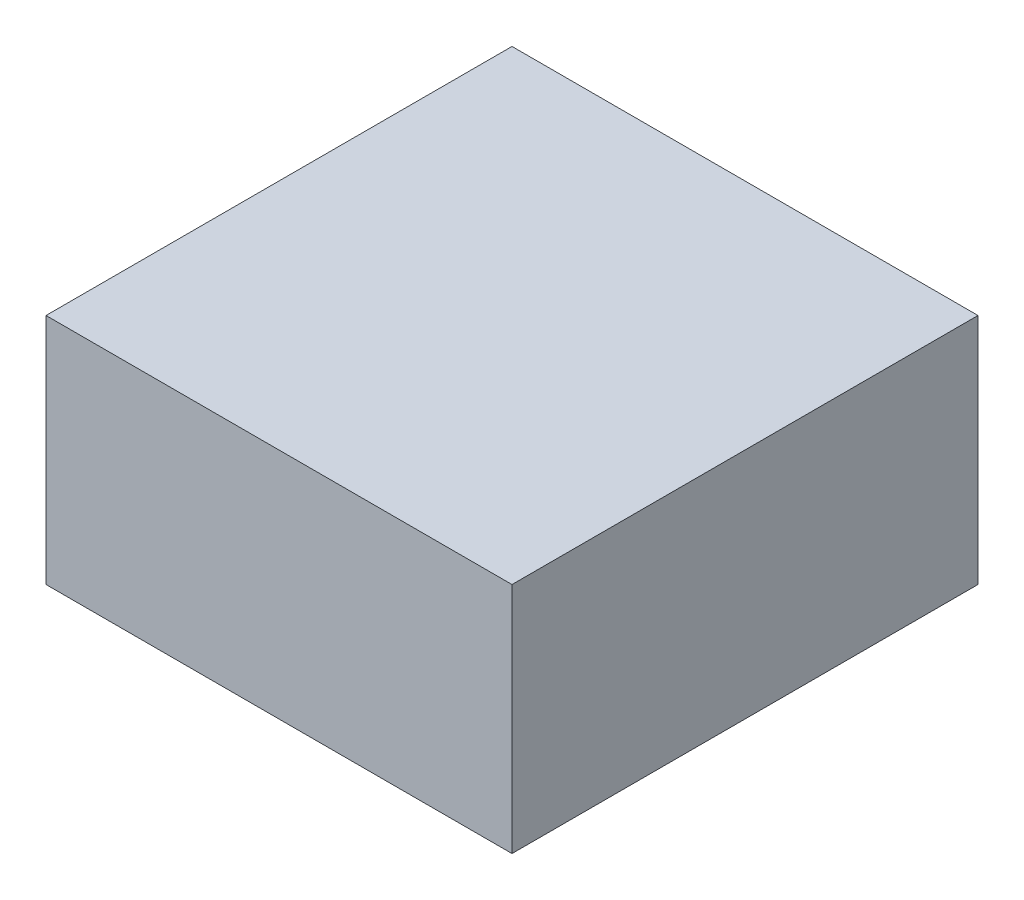
ISO-10303-21;
HEADER;
FILE_DESCRIPTION(('STEP AP214'),'2;1');
FILE_NAME('part.step','',(''),(''),'','','');
FILE_SCHEMA(('AUTOMOTIVE_DESIGN { 1 0 10303 214 1 1 1 1 }'));
ENDSEC;
DATA;
#1=APPLICATION_CONTEXT('core data for automotive mechanical design processes');
#2=APPLICATION_PROTOCOL_DEFINITION('international standard','automotive_design',2000,#1);
#3=PRODUCT_CONTEXT('',#1,'mechanical');
#4=PRODUCT('Part','Part','',(#3));
#5=PRODUCT_RELATED_PRODUCT_CATEGORY('part','',(#4));
#6=PRODUCT_DEFINITION_FORMATION('','',#4);
#7=PRODUCT_DEFINITION_CONTEXT('part definition',#1,'design');
#8=PRODUCT_DEFINITION('design','',#6,#7);
#9=PRODUCT_DEFINITION_SHAPE('','',#8);
#10=(LENGTH_UNIT() NAMED_UNIT(*) SI_UNIT(.MILLI.,.METRE.));
#11=(NAMED_UNIT(*) PLANE_ANGLE_UNIT() SI_UNIT($,.RADIAN.));
#12=(NAMED_UNIT(*) SI_UNIT($,.STERADIAN.) SOLID_ANGLE_UNIT());
#13=UNCERTAINTY_MEASURE_WITH_UNIT(LENGTH_MEASURE(1.E-05),#10,'distance_accuracy_value','');
#14=(GEOMETRIC_REPRESENTATION_CONTEXT(3) GLOBAL_UNCERTAINTY_ASSIGNED_CONTEXT((#13)) GLOBAL_UNIT_ASSIGNED_CONTEXT((#10,
#11,#12)) REPRESENTATION_CONTEXT('',''));
#15=CARTESIAN_POINT('',(0.,0.,0.));
#16=DIRECTION('',(0.,0.,1.));
#17=DIRECTION('',(1.,0.,0.));
#18=AXIS2_PLACEMENT_3D('',#15,#16,#17);
#19=CARTESIAN_POINT('',(0.,6.34999999999999,0.));
#20=DIRECTION('',(1.,0.,0.));
#21=DIRECTION('',(0.,0.,-1.));
#22=AXIS2_PLACEMENT_3D('',#19,#20,#21);
#23=PLANE('',#22);
#24=DIRECTION('',(0.,0.,1.));
#25=VECTOR('',#24,1.);
#26=CARTESIAN_POINT('',(0.,0.,0.));
#27=LINE('',#26,#25);
#28=CARTESIAN_POINT('',(0.,0.,-304.8));
#29=VERTEX_POINT('',#28);
#30=CARTESIAN_POINT('',(0.,0.,-292.1));
#31=VERTEX_POINT('',#30);
#32=EDGE_CURVE('E99',#29,#31,#27,.T.);
#33=ORIENTED_EDGE('',*,*,#32,.T.);
#34=DIRECTION('',(0.,1.,0.));
#35=VECTOR('',#34,1.);
#36=CARTESIAN_POINT('',(0.,0.,-292.1));
#37=LINE('',#36,#35);
#38=CARTESIAN_POINT('',(0.,6.34999999999999,-292.1));
#39=VERTEX_POINT('',#38);
#40=EDGE_CURVE('E48',#31,#39,#37,.T.);
#41=ORIENTED_EDGE('',*,*,#40,.T.);
#42=DIRECTION('',(0.,0.,1.));
#43=VECTOR('',#42,1.);
#44=CARTESIAN_POINT('',(0.,6.34999999999999,0.));
#45=LINE('',#44,#43);
#46=CARTESIAN_POINT('',(0.,6.35000000000005,-304.8));
#47=VERTEX_POINT('',#46);
#48=EDGE_CURVE('E101',#47,#39,#45,.T.);
#49=ORIENTED_EDGE('',*,*,#48,.F.);
#50=DIRECTION('',(0.,-1.,0.));
#51=VECTOR('',#50,1.);
#52=CARTESIAN_POINT('',(0.,6.35000000000005,-304.8));
#53=LINE('',#52,#51);
#54=EDGE_CURVE('E11',#47,#29,#53,.T.);
#55=ORIENTED_EDGE('',*,*,#54,.T.);
#56=EDGE_LOOP('',(#33,#41,#49,#55));
#57=FACE_BOUND('',#56,.T.);
#58=ADVANCED_FACE('F34',(#57),#23,.F.);
#59=CARTESIAN_POINT('',(0.,6.35000000000005,-304.8));
#60=DIRECTION('',(0.,0.,1.));
#61=DIRECTION('',(1.,0.,0.));
#62=AXIS2_PLACEMENT_3D('',#59,#60,#61);
#63=PLANE('',#62);
#64=DIRECTION('',(-1.,0.,0.));
#65=VECTOR('',#64,1.);
#66=CARTESIAN_POINT('',(0.,6.35000000000005,-304.8));
#67=LINE('',#66,#65);
#68=CARTESIAN_POINT('',(12.7,6.35000000000011,-304.8));
#69=VERTEX_POINT('',#68);
#70=EDGE_CURVE('E41',#69,#47,#67,.T.);
#71=ORIENTED_EDGE('',*,*,#70,.F.);
#72=DIRECTION('',(0.,1.,0.));
#73=VECTOR('',#72,1.);
#74=CARTESIAN_POINT('',(12.7,0.,-304.8));
#75=LINE('',#74,#73);
#76=CARTESIAN_POINT('',(12.7,0.,-304.8));
#77=VERTEX_POINT('',#76);
#78=EDGE_CURVE('E97',#77,#69,#75,.T.);
#79=ORIENTED_EDGE('',*,*,#78,.F.);
#80=DIRECTION('',(-1.,0.,0.));
#81=VECTOR('',#80,1.);
#82=CARTESIAN_POINT('',(0.,0.,-304.8));
#83=LINE('',#82,#81);
#84=EDGE_CURVE('E91',#77,#29,#83,.T.);
#85=ORIENTED_EDGE('',*,*,#84,.T.);
#86=ORIENTED_EDGE('',*,*,#54,.F.);
#87=EDGE_LOOP('',(#71,#79,#85,#86));
#88=FACE_BOUND('',#87,.T.);
#89=ADVANCED_FACE('F105',(#88),#63,.F.);
#90=CARTESIAN_POINT('',(0.,6.34999999999999,0.));
#91=DIRECTION('',(0.,-1.,0.));
#92=DIRECTION('',(0.,0.,-1.));
#93=AXIS2_PLACEMENT_3D('',#90,#91,#92);
#94=PLANE('',#93);
#95=DIRECTION('',(-1.,0.,0.));
#96=VECTOR('',#95,1.);
#97=CARTESIAN_POINT('',(12.7,6.35000000000005,-292.1));
#98=LINE('',#97,#96);
#99=CARTESIAN_POINT('',(12.7,6.35000000000005,-292.1));
#100=VERTEX_POINT('',#99);
#101=EDGE_CURVE('E92',#100,#39,#98,.T.);
#102=ORIENTED_EDGE('',*,*,#101,.F.);
#103=DIRECTION('',(0.,0.,1.));
#104=VECTOR('',#103,1.);
#105=CARTESIAN_POINT('',(12.7,6.35000000000011,-304.8));
#106=LINE('',#105,#104);
#107=EDGE_CURVE('E80',#69,#100,#106,.T.);
#108=ORIENTED_EDGE('',*,*,#107,.F.);
#109=ORIENTED_EDGE('',*,*,#70,.T.);
#110=ORIENTED_EDGE('',*,*,#48,.T.);
#111=EDGE_LOOP('',(#102,#108,#109,#110));
#112=FACE_BOUND('',#111,.T.);
#113=ADVANCED_FACE('F108',(#112),#94,.F.);
#114=CARTESIAN_POINT('',(0.,0.,0.));
#115=DIRECTION('',(0.,-1.,0.));
#116=DIRECTION('',(0.,0.,-1.));
#117=AXIS2_PLACEMENT_3D('',#114,#115,#116);
#118=PLANE('',#117);
#119=DIRECTION('',(0.,0.,1.));
#120=VECTOR('',#119,1.);
#121=CARTESIAN_POINT('',(12.7,0.,-304.8));
#122=LINE('',#121,#120);
#123=CARTESIAN_POINT('',(12.7,0.,-292.1));
#124=VERTEX_POINT('',#123);
#125=EDGE_CURVE('E78',#77,#124,#122,.T.);
#126=ORIENTED_EDGE('',*,*,#125,.T.);
#127=DIRECTION('',(-1.,0.,0.));
#128=VECTOR('',#127,1.);
#129=CARTESIAN_POINT('',(12.7,0.,-292.1));
#130=LINE('',#129,#128);
#131=EDGE_CURVE('E82',#124,#31,#130,.T.);
#132=ORIENTED_EDGE('',*,*,#131,.T.);
#133=ORIENTED_EDGE('',*,*,#32,.F.);
#134=ORIENTED_EDGE('',*,*,#84,.F.);
#135=EDGE_LOOP('',(#126,#132,#133,#134));
#136=FACE_BOUND('',#135,.T.);
#137=ADVANCED_FACE('F90',(#136),#118,.T.);
#138=CARTESIAN_POINT('',(12.7,0.,-304.8));
#139=DIRECTION('',(-1.,0.,0.));
#140=DIRECTION('',(0.,0.,1.));
#141=AXIS2_PLACEMENT_3D('',#138,#139,#140);
#142=PLANE('',#141);
#143=ORIENTED_EDGE('',*,*,#107,.T.);
#144=DIRECTION('',(0.,1.,0.));
#145=VECTOR('',#144,1.);
#146=CARTESIAN_POINT('',(12.7,0.,-292.1));
#147=LINE('',#146,#145);
#148=EDGE_CURVE('E75',#124,#100,#147,.T.);
#149=ORIENTED_EDGE('',*,*,#148,.F.);
#150=ORIENTED_EDGE('',*,*,#125,.F.);
#151=ORIENTED_EDGE('',*,*,#78,.T.);
#152=EDGE_LOOP('',(#143,#149,#150,#151));
#153=FACE_BOUND('',#152,.T.);
#154=ADVANCED_FACE('F76',(#153),#142,.F.);
#155=CARTESIAN_POINT('',(12.7,0.,-292.1));
#156=DIRECTION('',(0.,0.,-1.));
#157=DIRECTION('',(-1.,0.,0.));
#158=AXIS2_PLACEMENT_3D('',#155,#156,#157);
#159=PLANE('',#158);
#160=ORIENTED_EDGE('',*,*,#101,.T.);
#161=ORIENTED_EDGE('',*,*,#40,.F.);
#162=ORIENTED_EDGE('',*,*,#131,.F.);
#163=ORIENTED_EDGE('',*,*,#148,.T.);
#164=EDGE_LOOP('',(#160,#161,#162,#163));
#165=FACE_BOUND('',#164,.T.);
#166=ADVANCED_FACE('F84',(#165),#159,.F.);
#167=CLOSED_SHELL('',(#58,#89,#113,#137,#154,#166));
#168=MANIFOLD_SOLID_BREP('B2',#167);
#169=ADVANCED_BREP_SHAPE_REPRESENTATION('',(#18,#168),#14);
#170=SHAPE_DEFINITION_REPRESENTATION(#9,#169);
ENDSEC;
END-ISO-10303-21;
